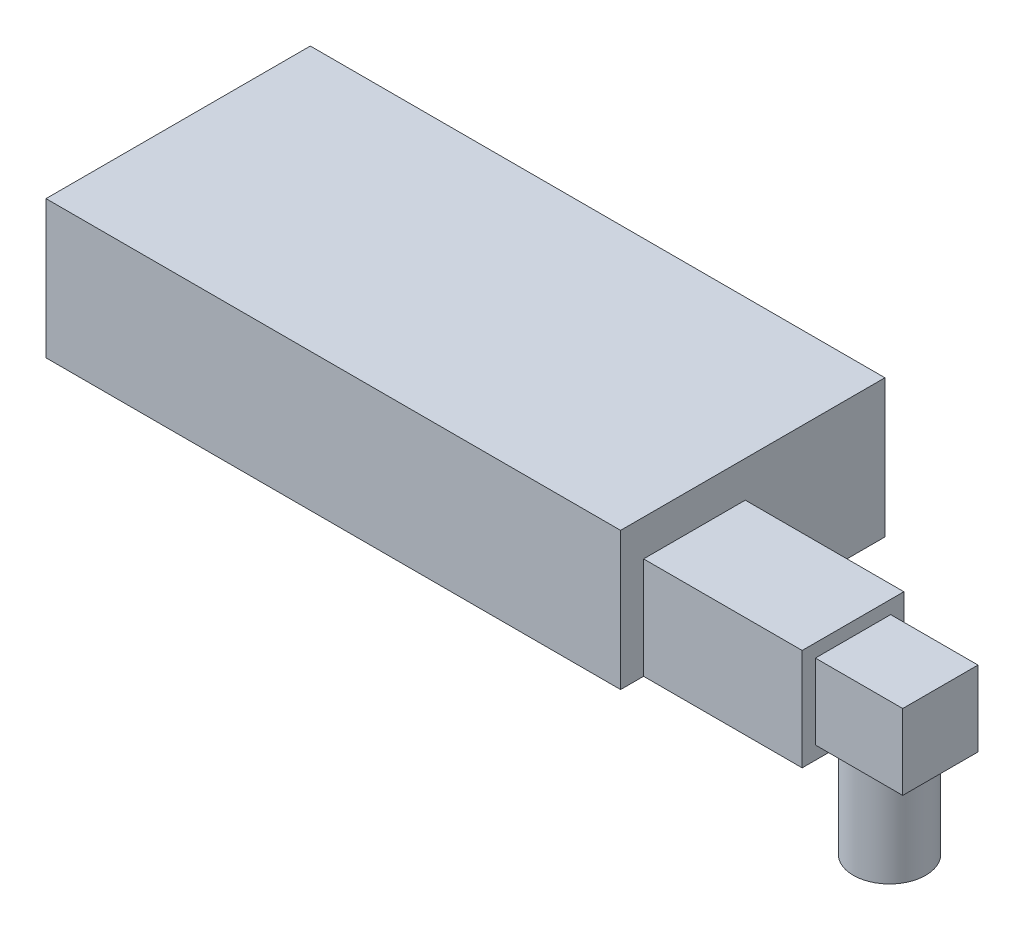
ISO-10303-21;
HEADER;
FILE_DESCRIPTION(('STEP AP214'),'2;1');
FILE_NAME('part.step','',(''),(''),'','','');
FILE_SCHEMA(('AUTOMOTIVE_DESIGN { 1 0 10303 214 1 1 1 1 }'));
ENDSEC;
DATA;
#1=APPLICATION_CONTEXT('core data for automotive mechanical design processes');
#2=APPLICATION_PROTOCOL_DEFINITION('international standard','automotive_design',2000,#1);
#3=PRODUCT_CONTEXT('',#1,'mechanical');
#4=PRODUCT('Part','Part','',(#3));
#5=PRODUCT_RELATED_PRODUCT_CATEGORY('part','',(#4));
#6=PRODUCT_DEFINITION_FORMATION('','',#4);
#7=PRODUCT_DEFINITION_CONTEXT('part definition',#1,'design');
#8=PRODUCT_DEFINITION('design','',#6,#7);
#9=PRODUCT_DEFINITION_SHAPE('','',#8);
#10=(LENGTH_UNIT() NAMED_UNIT(*) SI_UNIT(.MILLI.,.METRE.));
#11=(NAMED_UNIT(*) PLANE_ANGLE_UNIT() SI_UNIT($,.RADIAN.));
#12=(NAMED_UNIT(*) SI_UNIT($,.STERADIAN.) SOLID_ANGLE_UNIT());
#13=UNCERTAINTY_MEASURE_WITH_UNIT(LENGTH_MEASURE(1.E-05),#10,'distance_accuracy_value','');
#14=(GEOMETRIC_REPRESENTATION_CONTEXT(3) GLOBAL_UNCERTAINTY_ASSIGNED_CONTEXT((#13)) GLOBAL_UNIT_ASSIGNED_CONTEXT((#10,
#11,#12)) REPRESENTATION_CONTEXT('',''));
#15=CARTESIAN_POINT('',(0.,0.,0.));
#16=DIRECTION('',(0.,0.,1.));
#17=DIRECTION('',(1.,0.,0.));
#18=AXIS2_PLACEMENT_3D('',#15,#16,#17);
#19=CARTESIAN_POINT('',(41.975,-7.15,5.075));
#20=DIRECTION('',(0.,1.,0.));
#21=DIRECTION('',(0.,0.,1.));
#22=AXIS2_PLACEMENT_3D('',#19,#20,#21);
#23=CYLINDRICAL_SURFACE('',#22,3.15);
#24=CARTESIAN_POINT('',(41.975,-7.15,5.075));
#25=DIRECTION('',(0.,-1.,0.));
#26=DIRECTION('',(0.,0.,-1.));
#27=AXIS2_PLACEMENT_3D('',#24,#25,#26);
#28=CIRCLE('',#27,3.15);
#29=CARTESIAN_POINT('',(41.975,-7.15,8.225));
#30=VERTEX_POINT('',#29);
#31=EDGE_CURVE('E11',#30,#30,#28,.F.);
#32=CARTESIAN_POINT('',(41.975,1.15,5.075));
#33=DIRECTION('',(0.,-1.,0.));
#34=DIRECTION('',(0.,0.,-1.));
#35=AXIS2_PLACEMENT_3D('',#32,#33,#34);
#36=CIRCLE('',#35,3.15);
#37=CARTESIAN_POINT('',(41.975,1.15,8.225));
#38=VERTEX_POINT('',#37);
#39=EDGE_CURVE('E47',#38,#38,#36,.F.);
#40=CARTESIAN_POINT('',(41.975,-7.15,8.225));
#41=CARTESIAN_POINT('',(41.975,-7.06354166666667,8.225));
#42=CARTESIAN_POINT('',(41.975,-6.97708333333333,8.225));
#43=CARTESIAN_POINT('',(41.975,-6.80416666666667,8.225));
#44=CARTESIAN_POINT('',(41.975,-6.71770833333333,8.225));
#45=CARTESIAN_POINT('',(41.975,-6.54479166666667,8.225));
#46=CARTESIAN_POINT('',(41.975,-6.45833333333333,8.225));
#47=CARTESIAN_POINT('',(41.975,-6.28541666666667,8.225));
#48=CARTESIAN_POINT('',(41.975,-6.19895833333333,8.225));
#49=CARTESIAN_POINT('',(41.975,-6.02604166666667,8.225));
#50=CARTESIAN_POINT('',(41.975,-5.93958333333333,8.225));
#51=CARTESIAN_POINT('',(41.975,-5.76666666666667,8.225));
#52=CARTESIAN_POINT('',(41.975,-5.68020833333333,8.225));
#53=CARTESIAN_POINT('',(41.975,-5.50729166666667,8.225));
#54=CARTESIAN_POINT('',(41.975,-5.42083333333333,8.225));
#55=CARTESIAN_POINT('',(41.975,-5.24791666666667,8.225));
#56=CARTESIAN_POINT('',(41.975,-5.16145833333333,8.225));
#57=CARTESIAN_POINT('',(41.975,-4.98854166666667,8.225));
#58=CARTESIAN_POINT('',(41.975,-4.90208333333333,8.225));
#59=CARTESIAN_POINT('',(41.975,-4.72916666666667,8.225));
#60=CARTESIAN_POINT('',(41.975,-4.64270833333333,8.225));
#61=CARTESIAN_POINT('',(41.975,-4.46979166666667,8.225));
#62=CARTESIAN_POINT('',(41.975,-4.38333333333333,8.225));
#63=CARTESIAN_POINT('',(41.975,-4.21041666666667,8.225));
#64=CARTESIAN_POINT('',(41.975,-4.12395833333333,8.225));
#65=CARTESIAN_POINT('',(41.975,-3.95104166666667,8.225));
#66=CARTESIAN_POINT('',(41.975,-3.86458333333333,8.225));
#67=CARTESIAN_POINT('',(41.975,-3.69166666666667,8.225));
#68=CARTESIAN_POINT('',(41.975,-3.60520833333333,8.225));
#69=CARTESIAN_POINT('',(41.975,-3.43229166666667,8.225));
#70=CARTESIAN_POINT('',(41.975,-3.34583333333333,8.225));
#71=CARTESIAN_POINT('',(41.975,-3.17291666666667,8.225));
#72=CARTESIAN_POINT('',(41.975,-3.08645833333333,8.225));
#73=CARTESIAN_POINT('',(41.975,-2.91354166666667,8.225));
#74=CARTESIAN_POINT('',(41.975,-2.82708333333333,8.225));
#75=CARTESIAN_POINT('',(41.975,-2.65416666666667,8.225));
#76=CARTESIAN_POINT('',(41.975,-2.56770833333333,8.225));
#77=CARTESIAN_POINT('',(41.975,-2.39479166666667,8.225));
#78=CARTESIAN_POINT('',(41.975,-2.30833333333333,8.225));
#79=CARTESIAN_POINT('',(41.975,-2.13541666666667,8.225));
#80=CARTESIAN_POINT('',(41.975,-2.04895833333333,8.225));
#81=CARTESIAN_POINT('',(41.975,-1.87604166666667,8.225));
#82=CARTESIAN_POINT('',(41.975,-1.78958333333333,8.225));
#83=CARTESIAN_POINT('',(41.975,-1.61666666666667,8.225));
#84=CARTESIAN_POINT('',(41.975,-1.53020833333333,8.225));
#85=CARTESIAN_POINT('',(41.975,-1.35729166666667,8.225));
#86=CARTESIAN_POINT('',(41.975,-1.27083333333333,8.225));
#87=CARTESIAN_POINT('',(41.975,-1.09791666666667,8.225));
#88=CARTESIAN_POINT('',(41.975,-1.01145833333333,8.225));
#89=CARTESIAN_POINT('',(41.975,-0.838541666666666,8.225));
#90=CARTESIAN_POINT('',(41.975,-0.752083333333333,8.225));
#91=CARTESIAN_POINT('',(41.975,-0.579166666666666,8.225));
#92=CARTESIAN_POINT('',(41.975,-0.492708333333333,8.225));
#93=CARTESIAN_POINT('',(41.975,-0.319791666666666,8.225));
#94=CARTESIAN_POINT('',(41.975,-0.233333333333333,8.225));
#95=CARTESIAN_POINT('',(41.975,-0.0604166666666661,8.225));
#96=CARTESIAN_POINT('',(41.975,0.0260416666666673,8.225));
#97=CARTESIAN_POINT('',(41.975,0.198958333333334,8.225));
#98=CARTESIAN_POINT('',(41.975,0.285416666666667,8.225));
#99=CARTESIAN_POINT('',(41.975,0.458333333333334,8.225));
#100=CARTESIAN_POINT('',(41.975,0.544791666666667,8.225));
#101=CARTESIAN_POINT('',(41.975,0.717708333333334,8.225));
#102=CARTESIAN_POINT('',(41.975,0.804166666666667,8.225));
#103=CARTESIAN_POINT('',(41.975,0.977083333333334,8.225));
#104=CARTESIAN_POINT('',(41.975,1.06354166666667,8.225));
#105=CARTESIAN_POINT('',(41.975,1.15,8.225));
#106=B_SPLINE_CURVE_WITH_KNOTS('',3,(#40,#41,#42,#43,#44,#45,#46,#47,#48,#49,#50,#51,#52,#53,
#54,#55,#56,#57,#58,#59,#60,#61,#62,#63,#64,#65,#66,#67,#68,#69,#70,#71,#72,#73,#74,#75,#76,#77,
#78,#79,#80,#81,#82,#83,#84,#85,#86,#87,#88,#89,#90,#91,#92,#93,#94,#95,#96,#97,#98,#99,#100,
#101,#102,#103,#104,#105),.UNSPECIFIED.,.F.,.F.,(4,2,2,2,2,2,2,2,2,2,2,2,2,2,2,2,2,2,2,2,2,2,2,
2,2,2,2,2,2,2,2,2,4),(0.,0.259374999999999,0.518749999999999,0.778124999999999,1.0375,1.296875,
1.55625,1.815625,2.075,2.334375,2.59375,2.853125,3.1125,3.371875,3.63125,3.890625,4.15,4.409375,
4.66875,4.928125,5.1875,5.446875,5.70625,5.965625,6.225,6.484375,6.74375,7.003125,7.2625,
7.521875,7.78125,8.040625,8.3),.UNSPECIFIED.);
#107=EDGE_CURVE('BSEAM44',#30,#38,#106,.T.);
#108=ORIENTED_EDGE('',*,*,#31,.T.);
#109=ORIENTED_EDGE('',*,*,#39,.F.);
#110=ORIENTED_EDGE('',*,*,#107,.T.);
#111=ORIENTED_EDGE('',*,*,#107,.F.);
#112=EDGE_LOOP('',(#108,#110,#109,#111));
#113=FACE_BOUND('',#112,.T.);
#114=ADVANCED_FACE('F44',(#113),#23,.T.);
#115=CARTESIAN_POINT('',(0.,-7.15,0.));
#116=DIRECTION('',(0.,-1.,0.));
#117=DIRECTION('',(0.,0.,-1.));
#118=AXIS2_PLACEMENT_3D('',#115,#116,#117);
#119=PLANE('',#118);
#120=ORIENTED_EDGE('',*,*,#31,.F.);
#121=EDGE_LOOP('',(#120));
#122=FACE_BOUND('',#121,.T.);
#123=ADVANCED_FACE('F59',(#122),#119,.T.);
#124=CARTESIAN_POINT('',(0.,1.15,0.));
#125=DIRECTION('',(0.,-1.,0.));
#126=DIRECTION('',(0.,0.,-1.));
#127=AXIS2_PLACEMENT_3D('',#124,#125,#126);
#128=PLANE('',#127);
#129=ORIENTED_EDGE('',*,*,#39,.T.);
#130=EDGE_LOOP('',(#129));
#131=FACE_BOUND('',#130,.T.);
#132=ADVANCED_FACE('F56',(#131),#128,.F.);
#133=CLOSED_SHELL('',(#114,#123,#132));
#134=MANIFOLD_SOLID_BREP('B2',#133);
#135=CARTESIAN_POINT('',(46.4,0.,9.5));
#136=DIRECTION('',(0.,0.,-1.));
#137=DIRECTION('',(-1.,0.,0.));
#138=AXIS2_PLACEMENT_3D('',#135,#136,#137);
#139=PLANE('',#138);
#140=DIRECTION('',(0.,-1.,0.));
#141=VECTOR('',#140,1.);
#142=CARTESIAN_POINT('',(38.8,0.,9.5));
#143=LINE('',#142,#141);
#144=CARTESIAN_POINT('',(38.8,8.85,9.5));
#145=VERTEX_POINT('',#144);
#146=CARTESIAN_POINT('',(38.8,0.,9.5));
#147=VERTEX_POINT('',#146);
#148=EDGE_CURVE('E187',#145,#147,#143,.T.);
#149=ORIENTED_EDGE('',*,*,#148,.F.);
#150=DIRECTION('',(-1.,0.,0.));
#151=VECTOR('',#150,1.);
#152=CARTESIAN_POINT('',(46.4,8.85,9.5));
#153=LINE('',#152,#151);
#154=CARTESIAN_POINT('',(25.,8.85,9.5));
#155=VERTEX_POINT('',#154);
#156=EDGE_CURVE('E214',#145,#155,#153,.T.);
#157=ORIENTED_EDGE('',*,*,#156,.T.);
#158=DIRECTION('',(0.,-1.,0.));
#159=VECTOR('',#158,1.);
#160=CARTESIAN_POINT('',(25.,0.,9.5));
#161=LINE('',#160,#159);
#162=CARTESIAN_POINT('',(25.,0.,9.5));
#163=VERTEX_POINT('',#162);
#164=EDGE_CURVE('E199',#155,#163,#161,.T.);
#165=ORIENTED_EDGE('',*,*,#164,.T.);
#166=DIRECTION('',(-1.,0.,0.));
#167=VECTOR('',#166,1.);
#168=CARTESIAN_POINT('',(46.4,0.,9.5));
#169=LINE('',#168,#167);
#170=EDGE_CURVE('E42',#147,#163,#169,.T.);
#171=ORIENTED_EDGE('',*,*,#170,.F.);
#172=EDGE_LOOP('',(#149,#157,#165,#171));
#173=FACE_BOUND('',#172,.T.);
#174=ADVANCED_FACE('F94',(#173),#139,.F.);
#175=CARTESIAN_POINT('',(46.4,0.,9.5));
#176=DIRECTION('',(0.,1.,0.));
#177=DIRECTION('',(0.,0.,1.));
#178=AXIS2_PLACEMENT_3D('',#175,#176,#177);
#179=PLANE('',#178);
#180=DIRECTION('',(0.,0.,-1.));
#181=VECTOR('',#180,1.);
#182=CARTESIAN_POINT('',(38.8,0.,0.));
#183=LINE('',#182,#181);
#184=CARTESIAN_POINT('',(38.8,0.,0.650000000000003));
#185=VERTEX_POINT('',#184);
#186=EDGE_CURVE('E189',#147,#185,#183,.T.);
#187=ORIENTED_EDGE('',*,*,#186,.F.);
#188=ORIENTED_EDGE('',*,*,#170,.T.);
#189=DIRECTION('',(0.,0.,-1.));
#190=VECTOR('',#189,1.);
#191=CARTESIAN_POINT('',(25.,0.,9.5));
#192=LINE('',#191,#190);
#193=CARTESIAN_POINT('',(25.,0.,0.650000000000003));
#194=VERTEX_POINT('',#193);
#195=EDGE_CURVE('E205',#163,#194,#192,.T.);
#196=ORIENTED_EDGE('',*,*,#195,.T.);
#197=DIRECTION('',(-1.,0.,0.));
#198=VECTOR('',#197,1.);
#199=CARTESIAN_POINT('',(46.4,0.,0.650000000000003));
#200=LINE('',#199,#198);
#201=EDGE_CURVE('E101',#185,#194,#200,.T.);
#202=ORIENTED_EDGE('',*,*,#201,.F.);
#203=EDGE_LOOP('',(#187,#188,#196,#202));
#204=FACE_BOUND('',#203,.T.);
#205=ADVANCED_FACE('F226',(#204),#179,.F.);
#206=CARTESIAN_POINT('',(46.4,0.,0.650000000000003));
#207=DIRECTION('',(0.,0.,1.));
#208=DIRECTION('',(1.,0.,0.));
#209=AXIS2_PLACEMENT_3D('',#206,#207,#208);
#210=PLANE('',#209);
#211=DIRECTION('',(0.,1.,0.));
#212=VECTOR('',#211,1.);
#213=CARTESIAN_POINT('',(38.8,0.,0.650000000000003));
#214=LINE('',#213,#212);
#215=CARTESIAN_POINT('',(38.8,8.85,0.650000000000003));
#216=VERTEX_POINT('',#215);
#217=EDGE_CURVE('E108',#185,#216,#214,.T.);
#218=ORIENTED_EDGE('',*,*,#217,.F.);
#219=ORIENTED_EDGE('',*,*,#201,.T.);
#220=DIRECTION('',(0.,1.,0.));
#221=VECTOR('',#220,1.);
#222=CARTESIAN_POINT('',(25.,0.,0.650000000000003));
#223=LINE('',#222,#221);
#224=CARTESIAN_POINT('',(25.,8.85,0.650000000000003));
#225=VERTEX_POINT('',#224);
#226=EDGE_CURVE('E208',#194,#225,#223,.T.);
#227=ORIENTED_EDGE('',*,*,#226,.T.);
#228=DIRECTION('',(-1.,0.,0.));
#229=VECTOR('',#228,1.);
#230=CARTESIAN_POINT('',(46.4,8.85,0.650000000000003));
#231=LINE('',#230,#229);
#232=EDGE_CURVE('E216',#216,#225,#231,.T.);
#233=ORIENTED_EDGE('',*,*,#232,.F.);
#234=EDGE_LOOP('',(#218,#219,#227,#233));
#235=FACE_BOUND('',#234,.T.);
#236=ADVANCED_FACE('F219',(#235),#210,.F.);
#237=CARTESIAN_POINT('',(46.4,8.85,9.5));
#238=DIRECTION('',(0.,-1.,0.));
#239=DIRECTION('',(0.,0.,-1.));
#240=AXIS2_PLACEMENT_3D('',#237,#238,#239);
#241=PLANE('',#240);
#242=DIRECTION('',(0.,0.,1.));
#243=VECTOR('',#242,1.);
#244=CARTESIAN_POINT('',(38.8,8.85,0.));
#245=LINE('',#244,#243);
#246=EDGE_CURVE('E185',#216,#145,#245,.T.);
#247=ORIENTED_EDGE('',*,*,#246,.F.);
#248=ORIENTED_EDGE('',*,*,#232,.T.);
#249=DIRECTION('',(0.,0.,1.));
#250=VECTOR('',#249,1.);
#251=CARTESIAN_POINT('',(25.,8.85,9.5));
#252=LINE('',#251,#250);
#253=EDGE_CURVE('E211',#225,#155,#252,.T.);
#254=ORIENTED_EDGE('',*,*,#253,.T.);
#255=ORIENTED_EDGE('',*,*,#156,.F.);
#256=EDGE_LOOP('',(#247,#248,#254,#255));
#257=FACE_BOUND('',#256,.T.);
#258=ADVANCED_FACE('F233',(#257),#241,.F.);
#259=CARTESIAN_POINT('',(25.,0.,0.));
#260=DIRECTION('',(-1.,0.,0.));
#261=DIRECTION('',(0.,0.,1.));
#262=AXIS2_PLACEMENT_3D('',#259,#260,#261);
#263=PLANE('',#262);
#264=ORIENTED_EDGE('',*,*,#164,.F.);
#265=ORIENTED_EDGE('',*,*,#253,.F.);
#266=ORIENTED_EDGE('',*,*,#226,.F.);
#267=ORIENTED_EDGE('',*,*,#195,.F.);
#268=EDGE_LOOP('',(#264,#265,#266,#267));
#269=FACE_BOUND('',#268,.T.);
#270=ADVANCED_FACE('F230',(#269),#263,.T.);
#271=CARTESIAN_POINT('',(38.8,0.,1.8));
#272=DIRECTION('',(0.,0.,-1.));
#273=DIRECTION('',(-1.,0.,0.));
#274=AXIS2_PLACEMENT_3D('',#271,#272,#273);
#275=PLANE('',#274);
#276=DIRECTION('',(0.,1.,0.));
#277=VECTOR('',#276,1.);
#278=CARTESIAN_POINT('',(46.4,0.,1.8));
#279=LINE('',#278,#277);
#280=CARTESIAN_POINT('',(46.4,1.15,1.8));
#281=VERTEX_POINT('',#280);
#282=CARTESIAN_POINT('',(46.4,7.7,1.8));
#283=VERTEX_POINT('',#282);
#284=EDGE_CURVE('E116',#281,#283,#279,.T.);
#285=ORIENTED_EDGE('',*,*,#284,.F.);
#286=DIRECTION('',(1.,0.,0.));
#287=VECTOR('',#286,1.);
#288=CARTESIAN_POINT('',(38.8,1.15,1.8));
#289=LINE('',#288,#287);
#290=CARTESIAN_POINT('',(38.8,1.15,1.8));
#291=VERTEX_POINT('',#290);
#292=EDGE_CURVE('E160',#291,#281,#289,.T.);
#293=ORIENTED_EDGE('',*,*,#292,.F.);
#294=DIRECTION('',(0.,1.,0.));
#295=VECTOR('',#294,1.);
#296=CARTESIAN_POINT('',(38.8,0.,1.8));
#297=LINE('',#296,#295);
#298=CARTESIAN_POINT('',(38.8,7.7,1.8));
#299=VERTEX_POINT('',#298);
#300=EDGE_CURVE('E168',#291,#299,#297,.T.);
#301=ORIENTED_EDGE('',*,*,#300,.T.);
#302=DIRECTION('',(1.,0.,0.));
#303=VECTOR('',#302,1.);
#304=CARTESIAN_POINT('',(38.8,7.7,1.8));
#305=LINE('',#304,#303);
#306=EDGE_CURVE('E197',#299,#283,#305,.T.);
#307=ORIENTED_EDGE('',*,*,#306,.T.);
#308=EDGE_LOOP('',(#285,#293,#301,#307));
#309=FACE_BOUND('',#308,.T.);
#310=ADVANCED_FACE('F170',(#309),#275,.T.);
#311=CARTESIAN_POINT('',(38.8,7.7,0.));
#312=DIRECTION('',(0.,-1.,0.));
#313=DIRECTION('',(0.,0.,-1.));
#314=AXIS2_PLACEMENT_3D('',#311,#312,#313);
#315=PLANE('',#314);
#316=DIRECTION('',(0.,0.,-1.));
#317=VECTOR('',#316,1.);
#318=CARTESIAN_POINT('',(46.4,7.7,0.));
#319=LINE('',#318,#317);
#320=CARTESIAN_POINT('',(46.4,7.7,8.35));
#321=VERTEX_POINT('',#320);
#322=EDGE_CURVE('E177',#321,#283,#319,.T.);
#323=ORIENTED_EDGE('',*,*,#322,.T.);
#324=ORIENTED_EDGE('',*,*,#306,.F.);
#325=DIRECTION('',(0.,0.,-1.));
#326=VECTOR('',#325,1.);
#327=CARTESIAN_POINT('',(38.8,7.7,0.));
#328=LINE('',#327,#326);
#329=CARTESIAN_POINT('',(38.8,7.7,8.35));
#330=VERTEX_POINT('',#329);
#331=EDGE_CURVE('E176',#330,#299,#328,.T.);
#332=ORIENTED_EDGE('',*,*,#331,.F.);
#333=DIRECTION('',(1.,0.,0.));
#334=VECTOR('',#333,1.);
#335=CARTESIAN_POINT('',(38.8,7.7,8.35));
#336=LINE('',#335,#334);
#337=EDGE_CURVE('E200',#330,#321,#336,.T.);
#338=ORIENTED_EDGE('',*,*,#337,.T.);
#339=EDGE_LOOP('',(#323,#324,#332,#338));
#340=FACE_BOUND('',#339,.T.);
#341=ADVANCED_FACE('F255',(#340),#315,.F.);
#342=CARTESIAN_POINT('',(38.8,0.,8.35));
#343=DIRECTION('',(0.,0.,-1.));
#344=DIRECTION('',(-1.,0.,0.));
#345=AXIS2_PLACEMENT_3D('',#342,#343,#344);
#346=PLANE('',#345);
#347=DIRECTION('',(0.,1.,0.));
#348=VECTOR('',#347,1.);
#349=CARTESIAN_POINT('',(46.4,0.,8.35));
#350=LINE('',#349,#348);
#351=CARTESIAN_POINT('',(46.4,1.15,8.35));
#352=VERTEX_POINT('',#351);
#353=EDGE_CURVE('E180',#352,#321,#350,.T.);
#354=ORIENTED_EDGE('',*,*,#353,.T.);
#355=ORIENTED_EDGE('',*,*,#337,.F.);
#356=DIRECTION('',(0.,1.,0.));
#357=VECTOR('',#356,1.);
#358=CARTESIAN_POINT('',(38.8,0.,8.35));
#359=LINE('',#358,#357);
#360=CARTESIAN_POINT('',(38.8,1.15,8.35));
#361=VERTEX_POINT('',#360);
#362=EDGE_CURVE('E167',#361,#330,#359,.T.);
#363=ORIENTED_EDGE('',*,*,#362,.F.);
#364=DIRECTION('',(1.,0.,0.));
#365=VECTOR('',#364,1.);
#366=CARTESIAN_POINT('',(38.8,1.15,8.35));
#367=LINE('',#366,#365);
#368=EDGE_CURVE('E162',#361,#352,#367,.T.);
#369=ORIENTED_EDGE('',*,*,#368,.T.);
#370=EDGE_LOOP('',(#354,#355,#363,#369));
#371=FACE_BOUND('',#370,.T.);
#372=ADVANCED_FACE('F258',(#371),#346,.F.);
#373=CARTESIAN_POINT('',(38.8,1.15,0.));
#374=DIRECTION('',(0.,-1.,0.));
#375=DIRECTION('',(0.,0.,-1.));
#376=AXIS2_PLACEMENT_3D('',#373,#374,#375);
#377=PLANE('',#376);
#378=DIRECTION('',(0.,0.,-1.));
#379=VECTOR('',#378,1.);
#380=CARTESIAN_POINT('',(46.4,1.15,0.));
#381=LINE('',#380,#379);
#382=EDGE_CURVE('E193',#352,#281,#381,.T.);
#383=ORIENTED_EDGE('',*,*,#382,.F.);
#384=ORIENTED_EDGE('',*,*,#368,.F.);
#385=DIRECTION('',(0.,0.,-1.));
#386=VECTOR('',#385,1.);
#387=CARTESIAN_POINT('',(38.8,1.15,0.));
#388=LINE('',#387,#386);
#389=EDGE_CURVE('E157',#361,#291,#388,.T.);
#390=ORIENTED_EDGE('',*,*,#389,.T.);
#391=ORIENTED_EDGE('',*,*,#292,.T.);
#392=EDGE_LOOP('',(#383,#384,#390,#391));
#393=FACE_BOUND('',#392,.T.);
#394=ADVANCED_FACE('F159',(#393),#377,.T.);
#395=CARTESIAN_POINT('',(38.8,0.,0.));
#396=DIRECTION('',(1.,0.,0.));
#397=DIRECTION('',(0.,0.,-1.));
#398=AXIS2_PLACEMENT_3D('',#395,#396,#397);
#399=PLANE('',#398);
#400=ORIENTED_EDGE('',*,*,#300,.F.);
#401=ORIENTED_EDGE('',*,*,#389,.F.);
#402=ORIENTED_EDGE('',*,*,#362,.T.);
#403=ORIENTED_EDGE('',*,*,#331,.T.);
#404=EDGE_LOOP('',(#400,#401,#402,#403));
#405=FACE_BOUND('',#404,.T.);
#406=ORIENTED_EDGE('',*,*,#246,.T.);
#407=ORIENTED_EDGE('',*,*,#148,.T.);
#408=ORIENTED_EDGE('',*,*,#186,.T.);
#409=ORIENTED_EDGE('',*,*,#217,.T.);
#410=EDGE_LOOP('',(#406,#407,#408,#409));
#411=FACE_BOUND('',#410,.T.);
#412=ADVANCED_FACE('F174',(#405,#411),#399,.T.);
#413=CARTESIAN_POINT('',(46.4,0.,0.));
#414=DIRECTION('',(-1.,0.,0.));
#415=DIRECTION('',(0.,0.,1.));
#416=AXIS2_PLACEMENT_3D('',#413,#414,#415);
#417=PLANE('',#416);
#418=ORIENTED_EDGE('',*,*,#284,.T.);
#419=ORIENTED_EDGE('',*,*,#322,.F.);
#420=ORIENTED_EDGE('',*,*,#353,.F.);
#421=ORIENTED_EDGE('',*,*,#382,.T.);
#422=EDGE_LOOP('',(#418,#419,#420,#421));
#423=FACE_BOUND('',#422,.T.);
#424=ADVANCED_FACE('F249',(#423),#417,.F.);
#425=CLOSED_SHELL('',(#174,#205,#236,#258,#270,#310,#341,#372,#394,#412,#424));
#426=MANIFOLD_SOLID_BREP('B6',#425);
#427=CARTESIAN_POINT('',(25.,12.,-11.5));
#428=DIRECTION('',(-1.,0.,0.));
#429=DIRECTION('',(0.,0.,1.));
#430=AXIS2_PLACEMENT_3D('',#427,#428,#429);
#431=PLANE('',#430);
#432=DIRECTION('',(0.,0.,-1.));
#433=VECTOR('',#432,1.);
#434=CARTESIAN_POINT('',(25.,0.,-11.5));
#435=LINE('',#434,#433);
#436=CARTESIAN_POINT('',(25.,0.,11.5));
#437=VERTEX_POINT('',#436);
#438=CARTESIAN_POINT('',(25.,0.,-11.5));
#439=VERTEX_POINT('',#438);
#440=EDGE_CURVE('E396',#437,#439,#435,.T.);
#441=ORIENTED_EDGE('',*,*,#440,.T.);
#442=DIRECTION('',(0.,-1.,0.));
#443=VECTOR('',#442,1.);
#444=CARTESIAN_POINT('',(25.,12.,-11.5));
#445=LINE('',#444,#443);
#446=CARTESIAN_POINT('',(25.,12.,-11.5));
#447=VERTEX_POINT('',#446);
#448=EDGE_CURVE('E92',#447,#439,#445,.T.);
#449=ORIENTED_EDGE('',*,*,#448,.F.);
#450=DIRECTION('',(0.,0.,-1.));
#451=VECTOR('',#450,1.);
#452=CARTESIAN_POINT('',(25.,12.,-11.5));
#453=LINE('',#452,#451);
#454=CARTESIAN_POINT('',(25.,12.,11.5));
#455=VERTEX_POINT('',#454);
#456=EDGE_CURVE('E384',#455,#447,#453,.T.);
#457=ORIENTED_EDGE('',*,*,#456,.F.);
#458=DIRECTION('',(0.,-1.,0.));
#459=VECTOR('',#458,1.);
#460=CARTESIAN_POINT('',(25.,12.,11.5));
#461=LINE('',#460,#459);
#462=EDGE_CURVE('E392',#455,#437,#461,.T.);
#463=ORIENTED_EDGE('',*,*,#462,.T.);
#464=EDGE_LOOP('',(#441,#449,#457,#463));
#465=FACE_BOUND('',#464,.T.);
#466=ADVANCED_FACE('F333',(#465),#431,.F.);
#467=CARTESIAN_POINT('',(-25.,12.,-11.5));
#468=DIRECTION('',(0.,0.,1.));
#469=DIRECTION('',(1.,0.,0.));
#470=AXIS2_PLACEMENT_3D('',#467,#468,#469);
#471=PLANE('',#470);
#472=DIRECTION('',(-1.,0.,0.));
#473=VECTOR('',#472,1.);
#474=CARTESIAN_POINT('',(-25.,0.,-11.5));
#475=LINE('',#474,#473);
#476=CARTESIAN_POINT('',(-25.,0.,-11.5));
#477=VERTEX_POINT('',#476);
#478=EDGE_CURVE('E388',#439,#477,#475,.T.);
#479=ORIENTED_EDGE('',*,*,#478,.T.);
#480=DIRECTION('',(0.,-1.,0.));
#481=VECTOR('',#480,1.);
#482=CARTESIAN_POINT('',(-25.,12.,-11.5));
#483=LINE('',#482,#481);
#484=CARTESIAN_POINT('',(-25.,12.,-11.5));
#485=VERTEX_POINT('',#484);
#486=EDGE_CURVE('E341',#485,#477,#483,.T.);
#487=ORIENTED_EDGE('',*,*,#486,.F.);
#488=DIRECTION('',(-1.,0.,0.));
#489=VECTOR('',#488,1.);
#490=CARTESIAN_POINT('',(-25.,12.,-11.5));
#491=LINE('',#490,#489);
#492=EDGE_CURVE('E379',#447,#485,#491,.T.);
#493=ORIENTED_EDGE('',*,*,#492,.F.);
#494=ORIENTED_EDGE('',*,*,#448,.T.);
#495=EDGE_LOOP('',(#479,#487,#493,#494));
#496=FACE_BOUND('',#495,.T.);
#497=ADVANCED_FACE('F387',(#496),#471,.F.);
#498=CARTESIAN_POINT('',(-25.,12.,-11.5));
#499=DIRECTION('',(1.,0.,0.));
#500=DIRECTION('',(0.,0.,-1.));
#501=AXIS2_PLACEMENT_3D('',#498,#499,#500);
#502=PLANE('',#501);
#503=DIRECTION('',(0.,0.,1.));
#504=VECTOR('',#503,1.);
#505=CARTESIAN_POINT('',(-25.,0.,-11.5));
#506=LINE('',#505,#504);
#507=CARTESIAN_POINT('',(-25.,0.,11.5));
#508=VERTEX_POINT('',#507);
#509=EDGE_CURVE('E366',#477,#508,#506,.T.);
#510=ORIENTED_EDGE('',*,*,#509,.T.);
#511=DIRECTION('',(0.,-1.,0.));
#512=VECTOR('',#511,1.);
#513=CARTESIAN_POINT('',(-25.,12.,11.5));
#514=LINE('',#513,#512);
#515=CARTESIAN_POINT('',(-25.,12.,11.5));
#516=VERTEX_POINT('',#515);
#517=EDGE_CURVE('E389',#516,#508,#514,.T.);
#518=ORIENTED_EDGE('',*,*,#517,.F.);
#519=DIRECTION('',(0.,0.,1.));
#520=VECTOR('',#519,1.);
#521=CARTESIAN_POINT('',(-25.,12.,-11.5));
#522=LINE('',#521,#520);
#523=EDGE_CURVE('E382',#485,#516,#522,.T.);
#524=ORIENTED_EDGE('',*,*,#523,.F.);
#525=ORIENTED_EDGE('',*,*,#486,.T.);
#526=EDGE_LOOP('',(#510,#518,#524,#525));
#527=FACE_BOUND('',#526,.T.);
#528=ADVANCED_FACE('F390',(#527),#502,.F.);
#529=CARTESIAN_POINT('',(-25.,12.,11.5));
#530=DIRECTION('',(0.,0.,-1.));
#531=DIRECTION('',(-1.,0.,0.));
#532=AXIS2_PLACEMENT_3D('',#529,#530,#531);
#533=PLANE('',#532);
#534=DIRECTION('',(1.,0.,0.));
#535=VECTOR('',#534,1.);
#536=CARTESIAN_POINT('',(-25.,0.,11.5));
#537=LINE('',#536,#535);
#538=EDGE_CURVE('E372',#508,#437,#537,.T.);
#539=ORIENTED_EDGE('',*,*,#538,.T.);
#540=ORIENTED_EDGE('',*,*,#462,.F.);
#541=DIRECTION('',(1.,0.,0.));
#542=VECTOR('',#541,1.);
#543=CARTESIAN_POINT('',(-25.,12.,11.5));
#544=LINE('',#543,#542);
#545=EDGE_CURVE('E349',#516,#455,#544,.T.);
#546=ORIENTED_EDGE('',*,*,#545,.F.);
#547=ORIENTED_EDGE('',*,*,#517,.T.);
#548=EDGE_LOOP('',(#539,#540,#546,#547));
#549=FACE_BOUND('',#548,.T.);
#550=ADVANCED_FACE('F403',(#549),#533,.F.);
#551=CARTESIAN_POINT('',(0.,12.,0.));
#552=DIRECTION('',(0.,1.,0.));
#553=DIRECTION('',(0.,0.,1.));
#554=AXIS2_PLACEMENT_3D('',#551,#552,#553);
#555=PLANE('',#554);
#556=ORIENTED_EDGE('',*,*,#456,.T.);
#557=ORIENTED_EDGE('',*,*,#492,.T.);
#558=ORIENTED_EDGE('',*,*,#523,.T.);
#559=ORIENTED_EDGE('',*,*,#545,.T.);
#560=EDGE_LOOP('',(#556,#557,#558,#559));
#561=FACE_BOUND('',#560,.T.);
#562=ADVANCED_FACE('F380',(#561),#555,.T.);
#563=CARTESIAN_POINT('',(0.,0.,0.));
#564=DIRECTION('',(0.,1.,0.));
#565=DIRECTION('',(0.,0.,1.));
#566=AXIS2_PLACEMENT_3D('',#563,#564,#565);
#567=PLANE('',#566);
#568=ORIENTED_EDGE('',*,*,#440,.F.);
#569=ORIENTED_EDGE('',*,*,#538,.F.);
#570=ORIENTED_EDGE('',*,*,#509,.F.);
#571=ORIENTED_EDGE('',*,*,#478,.F.);
#572=EDGE_LOOP('',(#568,#569,#570,#571));
#573=FACE_BOUND('',#572,.T.);
#574=ADVANCED_FACE('F406',(#573),#567,.F.);
#575=CLOSED_SHELL('',(#466,#497,#528,#550,#562,#574));
#576=MANIFOLD_SOLID_BREP('B36',#575);
#577=ADVANCED_BREP_SHAPE_REPRESENTATION('',(#18,#134,#426,#576),#14);
#578=SHAPE_DEFINITION_REPRESENTATION(#9,#577);
ENDSEC;
END-ISO-10303-21;
